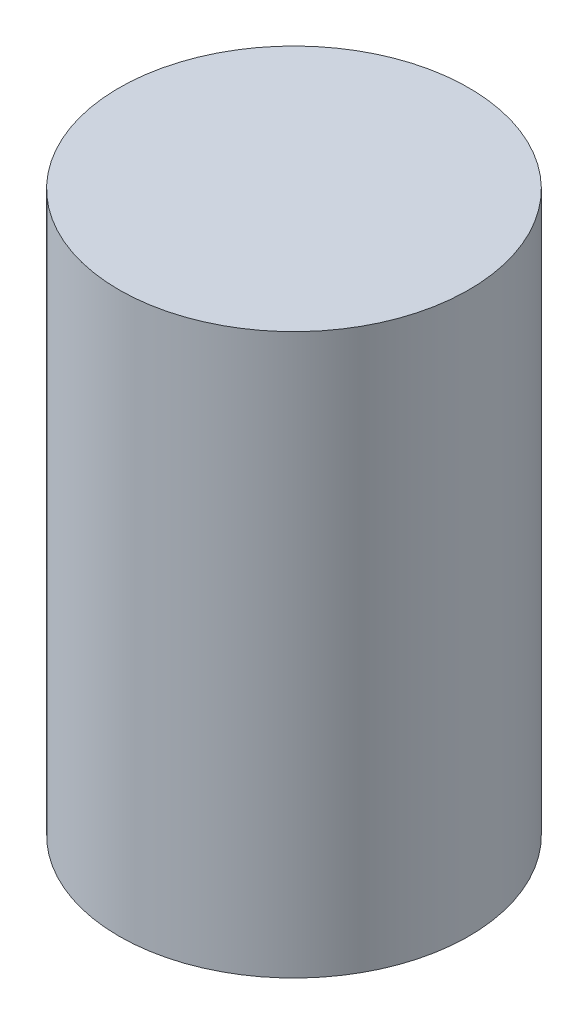
ISO-10303-21;
HEADER;
FILE_DESCRIPTION(('STEP AP214'),'2;1');
FILE_NAME('part.step','',(''),(''),'','','');
FILE_SCHEMA(('AUTOMOTIVE_DESIGN { 1 0 10303 214 1 1 1 1 }'));
ENDSEC;
DATA;
#1=APPLICATION_CONTEXT('core data for automotive mechanical design processes');
#2=APPLICATION_PROTOCOL_DEFINITION('international standard','automotive_design',2000,#1);
#3=PRODUCT_CONTEXT('',#1,'mechanical');
#4=PRODUCT('Part','Part','',(#3));
#5=PRODUCT_RELATED_PRODUCT_CATEGORY('part','',(#4));
#6=PRODUCT_DEFINITION_FORMATION('','',#4);
#7=PRODUCT_DEFINITION_CONTEXT('part definition',#1,'design');
#8=PRODUCT_DEFINITION('design','',#6,#7);
#9=PRODUCT_DEFINITION_SHAPE('','',#8);
#10=(LENGTH_UNIT() NAMED_UNIT(*) SI_UNIT(.MILLI.,.METRE.));
#11=(NAMED_UNIT(*) PLANE_ANGLE_UNIT() SI_UNIT($,.RADIAN.));
#12=(NAMED_UNIT(*) SI_UNIT($,.STERADIAN.) SOLID_ANGLE_UNIT());
#13=UNCERTAINTY_MEASURE_WITH_UNIT(LENGTH_MEASURE(1.E-05),#10,'distance_accuracy_value','');
#14=(GEOMETRIC_REPRESENTATION_CONTEXT(3) GLOBAL_UNCERTAINTY_ASSIGNED_CONTEXT((#13)) GLOBAL_UNIT_ASSIGNED_CONTEXT((#10,
#11,#12)) REPRESENTATION_CONTEXT('',''));
#15=CARTESIAN_POINT('',(0.,0.,0.));
#16=DIRECTION('',(0.,0.,1.));
#17=DIRECTION('',(1.,0.,0.));
#18=AXIS2_PLACEMENT_3D('',#15,#16,#17);
#19=CARTESIAN_POINT('',(0.,120.,0.));
#20=DIRECTION('',(0.,-1.,0.));
#21=DIRECTION('',(0.,0.,-1.));
#22=AXIS2_PLACEMENT_3D('',#19,#20,#21);
#23=CYLINDRICAL_SURFACE('',#22,37.5);
#24=CARTESIAN_POINT('',(0.,120.,0.));
#25=DIRECTION('',(0.,1.,0.));
#26=DIRECTION('',(0.,0.,1.));
#27=AXIS2_PLACEMENT_3D('',#24,#25,#26);
#28=CIRCLE('',#27,37.5);
#29=CARTESIAN_POINT('',(0.,120.,37.5));
#30=VERTEX_POINT('',#29);
#31=EDGE_CURVE('E10',#30,#30,#28,.T.);
#32=ORIENTED_EDGE('',*,*,#31,.F.);
#33=EDGE_LOOP('',(#32));
#34=FACE_BOUND('',#33,.T.);
#35=CARTESIAN_POINT('',(0.,0.,0.));
#36=DIRECTION('',(0.,1.,0.));
#37=DIRECTION('',(0.,0.,1.));
#38=AXIS2_PLACEMENT_3D('',#35,#36,#37);
#39=CIRCLE('',#38,37.5);
#40=CARTESIAN_POINT('',(0.,0.,37.5));
#41=VERTEX_POINT('',#40);
#42=EDGE_CURVE('E38',#41,#41,#39,.T.);
#43=ORIENTED_EDGE('',*,*,#42,.T.);
#44=EDGE_LOOP('',(#43));
#45=FACE_BOUND('',#44,.T.);
#46=ADVANCED_FACE('F35',(#34,#45),#23,.T.);
#47=CARTESIAN_POINT('',(0.,120.,0.));
#48=DIRECTION('',(0.,1.,0.));
#49=DIRECTION('',(0.,0.,1.));
#50=AXIS2_PLACEMENT_3D('',#47,#48,#49);
#51=PLANE('',#50);
#52=ORIENTED_EDGE('',*,*,#31,.T.);
#53=EDGE_LOOP('',(#52));
#54=FACE_BOUND('',#53,.T.);
#55=ADVANCED_FACE('F50',(#54),#51,.T.);
#56=CARTESIAN_POINT('',(0.,0.,0.));
#57=DIRECTION('',(0.,1.,0.));
#58=DIRECTION('',(0.,0.,1.));
#59=AXIS2_PLACEMENT_3D('',#56,#57,#58);
#60=PLANE('',#59);
#61=ORIENTED_EDGE('',*,*,#42,.F.);
#62=EDGE_LOOP('',(#61));
#63=FACE_BOUND('',#62,.T.);
#64=ADVANCED_FACE('F48',(#63),#60,.F.);
#65=CLOSED_SHELL('',(#46,#55,#64));
#66=MANIFOLD_SOLID_BREP('B2',#65);
#67=ADVANCED_BREP_SHAPE_REPRESENTATION('',(#18,#66),#14);
#68=SHAPE_DEFINITION_REPRESENTATION(#9,#67);
ENDSEC;
END-ISO-10303-21;
